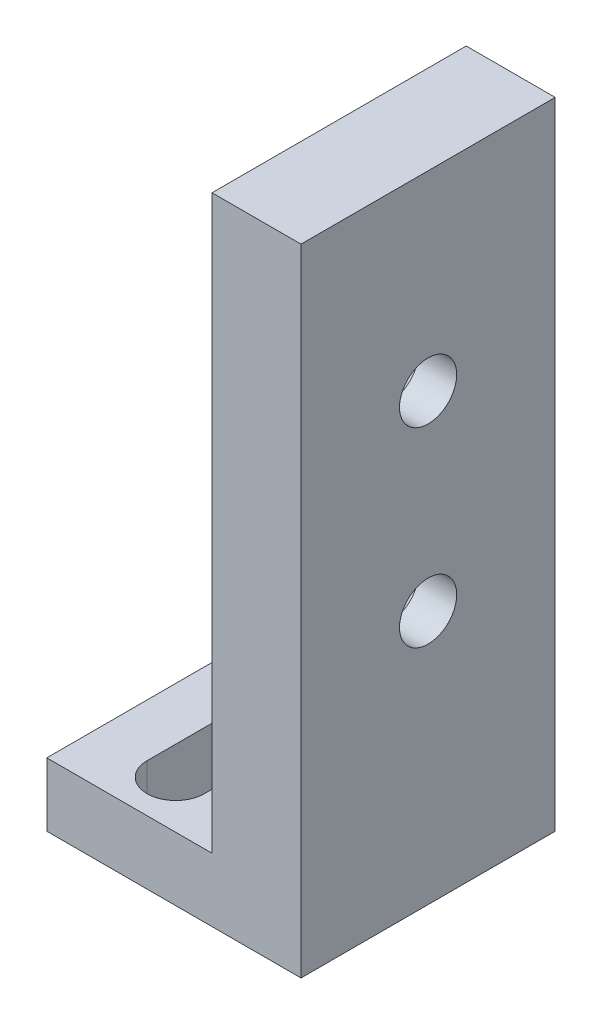
ISO-10303-21;
HEADER;
FILE_DESCRIPTION(('STEP AP214'),'2;1');
FILE_NAME('part.step','',(''),(''),'','','');
FILE_SCHEMA(('AUTOMOTIVE_DESIGN { 1 0 10303 214 1 1 1 1 }'));
ENDSEC;
DATA;
#1=APPLICATION_CONTEXT('core data for automotive mechanical design processes');
#2=APPLICATION_PROTOCOL_DEFINITION('international standard','automotive_design',2000,#1);
#3=PRODUCT_CONTEXT('',#1,'mechanical');
#4=PRODUCT('Part','Part','',(#3));
#5=PRODUCT_RELATED_PRODUCT_CATEGORY('part','',(#4));
#6=PRODUCT_DEFINITION_FORMATION('','',#4);
#7=PRODUCT_DEFINITION_CONTEXT('part definition',#1,'design');
#8=PRODUCT_DEFINITION('design','',#6,#7);
#9=PRODUCT_DEFINITION_SHAPE('','',#8);
#10=(LENGTH_UNIT() NAMED_UNIT(*) SI_UNIT(.MILLI.,.METRE.));
#11=(NAMED_UNIT(*) PLANE_ANGLE_UNIT() SI_UNIT($,.RADIAN.));
#12=(NAMED_UNIT(*) SI_UNIT($,.STERADIAN.) SOLID_ANGLE_UNIT());
#13=UNCERTAINTY_MEASURE_WITH_UNIT(LENGTH_MEASURE(1.E-05),#10,'distance_accuracy_value','');
#14=(GEOMETRIC_REPRESENTATION_CONTEXT(3) GLOBAL_UNCERTAINTY_ASSIGNED_CONTEXT((#13)) GLOBAL_UNIT_ASSIGNED_CONTEXT((#10,
#11,#12)) REPRESENTATION_CONTEXT('',''));
#15=CARTESIAN_POINT('',(0.,0.,0.));
#16=DIRECTION('',(0.,0.,1.));
#17=DIRECTION('',(1.,0.,0.));
#18=AXIS2_PLACEMENT_3D('',#15,#16,#17);
#19=CARTESIAN_POINT('',(20.,20.,10.));
#20=DIRECTION('',(-1.,0.,0.));
#21=DIRECTION('',(0.,0.,1.));
#22=AXIS2_PLACEMENT_3D('',#19,#20,#21);
#23=CYLINDRICAL_SURFACE('',#22,2.25);
#24=CARTESIAN_POINT('',(20.,20.,10.));
#25=DIRECTION('',(-1.,0.,0.));
#26=DIRECTION('',(0.,0.,1.));
#27=AXIS2_PLACEMENT_3D('',#24,#25,#26);
#28=CIRCLE('',#27,2.25);
#29=CARTESIAN_POINT('',(20.,20.,12.25));
#30=VERTEX_POINT('',#29);
#31=EDGE_CURVE('E254',#30,#30,#28,.T.);
#32=ORIENTED_EDGE('',*,*,#31,.F.);
#33=EDGE_LOOP('',(#32));
#34=FACE_BOUND('',#33,.T.);
#35=CARTESIAN_POINT('',(17.,20.,10.));
#36=DIRECTION('',(-1.,0.,0.));
#37=DIRECTION('',(0.,0.,1.));
#38=AXIS2_PLACEMENT_3D('',#35,#36,#37);
#39=CIRCLE('',#38,2.25);
#40=CARTESIAN_POINT('',(17.,20.,12.25));
#41=VERTEX_POINT('',#40);
#42=EDGE_CURVE('E222',#41,#41,#39,.T.);
#43=ORIENTED_EDGE('',*,*,#42,.T.);
#44=EDGE_LOOP('',(#43));
#45=FACE_BOUND('',#44,.T.);
#46=ADVANCED_FACE('F41',(#34,#45),#23,.F.);
#47=CARTESIAN_POINT('',(20.,35.,10.));
#48=DIRECTION('',(-1.,0.,0.));
#49=DIRECTION('',(0.,0.,1.));
#50=AXIS2_PLACEMENT_3D('',#47,#48,#49);
#51=CYLINDRICAL_SURFACE('',#50,2.25);
#52=CARTESIAN_POINT('',(20.,35.,10.));
#53=DIRECTION('',(-1.,0.,0.));
#54=DIRECTION('',(0.,0.,1.));
#55=AXIS2_PLACEMENT_3D('',#52,#53,#54);
#56=CIRCLE('',#55,2.25);
#57=CARTESIAN_POINT('',(20.,35.,12.25));
#58=VERTEX_POINT('',#57);
#59=EDGE_CURVE('E334',#58,#58,#56,.T.);
#60=ORIENTED_EDGE('',*,*,#59,.F.);
#61=EDGE_LOOP('',(#60));
#62=FACE_BOUND('',#61,.T.);
#63=CARTESIAN_POINT('',(17.,35.,10.));
#64=DIRECTION('',(-1.,0.,0.));
#65=DIRECTION('',(0.,0.,1.));
#66=AXIS2_PLACEMENT_3D('',#63,#64,#65);
#67=CIRCLE('',#66,2.25);
#68=CARTESIAN_POINT('',(17.,35.,12.25));
#69=VERTEX_POINT('',#68);
#70=EDGE_CURVE('E266',#69,#69,#67,.T.);
#71=ORIENTED_EDGE('',*,*,#70,.T.);
#72=EDGE_LOOP('',(#71));
#73=FACE_BOUND('',#72,.T.);
#74=ADVANCED_FACE('F482',(#62,#73),#51,.F.);
#75=CARTESIAN_POINT('',(20.,0.,20.));
#76=DIRECTION('',(0.,1.,0.));
#77=DIRECTION('',(-1.,0.,0.));
#78=AXIS2_PLACEMENT_3D('',#75,#76,#77);
#79=PLANE('',#78);
#80=DIRECTION('',(0.,0.,-1.));
#81=VECTOR('',#80,1.);
#82=CARTESIAN_POINT('',(8.63999999999999,0.,3.75));
#83=LINE('',#82,#81);
#84=CARTESIAN_POINT('',(8.64,0.,16.25));
#85=VERTEX_POINT('',#84);
#86=CARTESIAN_POINT('',(8.63999999999999,0.,3.75));
#87=VERTEX_POINT('',#86);
#88=EDGE_CURVE('E355',#85,#87,#83,.T.);
#89=ORIENTED_EDGE('',*,*,#88,.T.);
#90=CARTESIAN_POINT('',(6.39,0.,3.75));
#91=DIRECTION('',(0.,1.,0.));
#92=DIRECTION('',(0.,0.,1.));
#93=AXIS2_PLACEMENT_3D('',#90,#91,#92);
#94=CIRCLE('',#93,2.25);
#95=CARTESIAN_POINT('',(4.14,0.,3.75));
#96=VERTEX_POINT('',#95);
#97=EDGE_CURVE('E342',#87,#96,#94,.T.);
#98=ORIENTED_EDGE('',*,*,#97,.T.);
#99=DIRECTION('',(0.,0.,1.));
#100=VECTOR('',#99,1.);
#101=CARTESIAN_POINT('',(4.14,0.,3.75));
#102=LINE('',#101,#100);
#103=CARTESIAN_POINT('',(4.14,0.,16.25));
#104=VERTEX_POINT('',#103);
#105=EDGE_CURVE('E346',#96,#104,#102,.T.);
#106=ORIENTED_EDGE('',*,*,#105,.T.);
#107=CARTESIAN_POINT('',(6.39,0.,16.25));
#108=DIRECTION('',(0.,1.,0.));
#109=DIRECTION('',(0.,0.,1.));
#110=AXIS2_PLACEMENT_3D('',#107,#108,#109);
#111=CIRCLE('',#110,2.25);
#112=EDGE_CURVE('E351',#104,#85,#111,.T.);
#113=ORIENTED_EDGE('',*,*,#112,.T.);
#114=EDGE_LOOP('',(#89,#98,#106,#113));
#115=FACE_BOUND('',#114,.T.);
#116=DIRECTION('',(1.,0.,0.));
#117=VECTOR('',#116,1.);
#118=CARTESIAN_POINT('',(20.,0.,0.));
#119=LINE('',#118,#117);
#120=CARTESIAN_POINT('',(0.,0.,0.));
#121=VERTEX_POINT('',#120);
#122=CARTESIAN_POINT('',(20.,0.,0.));
#123=VERTEX_POINT('',#122);
#124=EDGE_CURVE('E376',#121,#123,#119,.T.);
#125=ORIENTED_EDGE('',*,*,#124,.T.);
#126=DIRECTION('',(0.,0.,-1.));
#127=VECTOR('',#126,1.);
#128=CARTESIAN_POINT('',(20.,0.,20.));
#129=LINE('',#128,#127);
#130=CARTESIAN_POINT('',(20.,0.,20.));
#131=VERTEX_POINT('',#130);
#132=EDGE_CURVE('E11',#131,#123,#129,.T.);
#133=ORIENTED_EDGE('',*,*,#132,.F.);
#134=DIRECTION('',(1.,0.,0.));
#135=VECTOR('',#134,1.);
#136=CARTESIAN_POINT('',(20.,0.,20.));
#137=LINE('',#136,#135);
#138=CARTESIAN_POINT('',(0.,0.,20.));
#139=VERTEX_POINT('',#138);
#140=EDGE_CURVE('E386',#139,#131,#137,.T.);
#141=ORIENTED_EDGE('',*,*,#140,.F.);
#142=DIRECTION('',(0.,0.,-1.));
#143=VECTOR('',#142,1.);
#144=CARTESIAN_POINT('',(0.,0.,20.));
#145=LINE('',#144,#143);
#146=EDGE_CURVE('E406',#139,#121,#145,.T.);
#147=ORIENTED_EDGE('',*,*,#146,.T.);
#148=EDGE_LOOP('',(#125,#133,#141,#147));
#149=FACE_BOUND('',#148,.T.);
#150=ADVANCED_FACE('F43',(#115,#149),#79,.F.);
#151=CARTESIAN_POINT('',(20.,50.,20.));
#152=DIRECTION('',(-1.,0.,0.));
#153=DIRECTION('',(0.,-1.,0.));
#154=AXIS2_PLACEMENT_3D('',#151,#152,#153);
#155=PLANE('',#154);
#156=ORIENTED_EDGE('',*,*,#59,.T.);
#157=EDGE_LOOP('',(#156));
#158=FACE_BOUND('',#157,.T.);
#159=ORIENTED_EDGE('',*,*,#31,.T.);
#160=EDGE_LOOP('',(#159));
#161=FACE_BOUND('',#160,.T.);
#162=DIRECTION('',(0.,1.,0.));
#163=VECTOR('',#162,1.);
#164=CARTESIAN_POINT('',(20.,50.,0.));
#165=LINE('',#164,#163);
#166=CARTESIAN_POINT('',(20.,50.,0.));
#167=VERTEX_POINT('',#166);
#168=EDGE_CURVE('E410',#123,#167,#165,.T.);
#169=ORIENTED_EDGE('',*,*,#168,.T.);
#170=DIRECTION('',(0.,0.,-1.));
#171=VECTOR('',#170,1.);
#172=CARTESIAN_POINT('',(20.,50.,20.));
#173=LINE('',#172,#171);
#174=CARTESIAN_POINT('',(20.,50.,20.));
#175=VERTEX_POINT('',#174);
#176=EDGE_CURVE('E50',#175,#167,#173,.T.);
#177=ORIENTED_EDGE('',*,*,#176,.F.);
#178=DIRECTION('',(0.,1.,0.));
#179=VECTOR('',#178,1.);
#180=CARTESIAN_POINT('',(20.,50.,20.));
#181=LINE('',#180,#179);
#182=EDGE_CURVE('E390',#131,#175,#181,.T.);
#183=ORIENTED_EDGE('',*,*,#182,.F.);
#184=ORIENTED_EDGE('',*,*,#132,.T.);
#185=EDGE_LOOP('',(#169,#177,#183,#184));
#186=FACE_BOUND('',#185,.T.);
#187=ADVANCED_FACE('F467',(#158,#161,#186),#155,.F.);
#188=CARTESIAN_POINT('',(13.,50.,20.));
#189=DIRECTION('',(0.,-1.,0.));
#190=DIRECTION('',(0.,0.,-1.));
#191=AXIS2_PLACEMENT_3D('',#188,#189,#190);
#192=PLANE('',#191);
#193=DIRECTION('',(-1.,0.,0.));
#194=VECTOR('',#193,1.);
#195=CARTESIAN_POINT('',(13.,50.,0.));
#196=LINE('',#195,#194);
#197=CARTESIAN_POINT('',(13.,50.,0.));
#198=VERTEX_POINT('',#197);
#199=EDGE_CURVE('E413',#167,#198,#196,.T.);
#200=ORIENTED_EDGE('',*,*,#199,.T.);
#201=DIRECTION('',(0.,0.,-1.));
#202=VECTOR('',#201,1.);
#203=CARTESIAN_POINT('',(13.,50.,20.));
#204=LINE('',#203,#202);
#205=CARTESIAN_POINT('',(13.,50.,20.));
#206=VERTEX_POINT('',#205);
#207=EDGE_CURVE('E435',#206,#198,#204,.T.);
#208=ORIENTED_EDGE('',*,*,#207,.F.);
#209=DIRECTION('',(-1.,0.,0.));
#210=VECTOR('',#209,1.);
#211=CARTESIAN_POINT('',(13.,50.,20.));
#212=LINE('',#211,#210);
#213=EDGE_CURVE('E394',#175,#206,#212,.T.);
#214=ORIENTED_EDGE('',*,*,#213,.F.);
#215=ORIENTED_EDGE('',*,*,#176,.T.);
#216=EDGE_LOOP('',(#200,#208,#214,#215));
#217=FACE_BOUND('',#216,.T.);
#218=ADVANCED_FACE('F444',(#217),#192,.F.);
#219=CARTESIAN_POINT('',(13.,5.,20.));
#220=DIRECTION('',(1.,0.,0.));
#221=DIRECTION('',(0.,1.,0.));
#222=AXIS2_PLACEMENT_3D('',#219,#220,#221);
#223=PLANE('',#222);
#224=DIRECTION('',(0.,-0.866025403784438,0.500000000000001));
#225=VECTOR('',#224,1.);
#226=CARTESIAN_POINT('',(13.,20.,5.95854811567261));
#227=LINE('',#226,#225);
#228=CARTESIAN_POINT('',(13.,20.,5.95854811567261));
#229=VERTEX_POINT('',#228);
#230=CARTESIAN_POINT('',(13.,16.5,7.97927405783631));
#231=VERTEX_POINT('',#230);
#232=EDGE_CURVE('E237',#229,#231,#227,.T.);
#233=ORIENTED_EDGE('',*,*,#232,.F.);
#234=DIRECTION('',(0.,-0.866025403784438,-0.500000000000001));
#235=VECTOR('',#234,1.);
#236=CARTESIAN_POINT('',(13.,23.5,7.97927405783631));
#237=LINE('',#236,#235);
#238=CARTESIAN_POINT('',(13.,23.5,7.97927405783631));
#239=VERTEX_POINT('',#238);
#240=EDGE_CURVE('E57',#239,#229,#237,.T.);
#241=ORIENTED_EDGE('',*,*,#240,.F.);
#242=DIRECTION('',(0.,0.,-1.));
#243=VECTOR('',#242,1.);
#244=CARTESIAN_POINT('',(13.,23.5,12.0207259421637));
#245=LINE('',#244,#243);
#246=CARTESIAN_POINT('',(13.,23.5,12.0207259421637));
#247=VERTEX_POINT('',#246);
#248=EDGE_CURVE('E215',#247,#239,#245,.T.);
#249=ORIENTED_EDGE('',*,*,#248,.F.);
#250=DIRECTION('',(0.,0.866025403784438,-0.500000000000001));
#251=VECTOR('',#250,1.);
#252=CARTESIAN_POINT('',(13.,20.,14.0414518843274));
#253=LINE('',#252,#251);
#254=CARTESIAN_POINT('',(13.,20.,14.0414518843274));
#255=VERTEX_POINT('',#254);
#256=EDGE_CURVE('E219',#255,#247,#253,.T.);
#257=ORIENTED_EDGE('',*,*,#256,.F.);
#258=DIRECTION('',(0.,0.866025403784438,0.500000000000001));
#259=VECTOR('',#258,1.);
#260=CARTESIAN_POINT('',(13.,16.5,12.0207259421637));
#261=LINE('',#260,#259);
#262=CARTESIAN_POINT('',(13.,16.5,12.0207259421637));
#263=VERTEX_POINT('',#262);
#264=EDGE_CURVE('E244',#263,#255,#261,.T.);
#265=ORIENTED_EDGE('',*,*,#264,.F.);
#266=DIRECTION('',(0.,0.,1.));
#267=VECTOR('',#266,1.);
#268=CARTESIAN_POINT('',(13.,16.5,7.97927405783631));
#269=LINE('',#268,#267);
#270=EDGE_CURVE('E240',#231,#263,#269,.T.);
#271=ORIENTED_EDGE('',*,*,#270,.F.);
#272=EDGE_LOOP('',(#233,#241,#249,#257,#265,#271));
#273=FACE_BOUND('',#272,.T.);
#274=DIRECTION('',(0.,-0.866025403784438,0.5));
#275=VECTOR('',#274,1.);
#276=CARTESIAN_POINT('',(13.,35.,5.95854811567262));
#277=LINE('',#276,#275);
#278=CARTESIAN_POINT('',(13.,35.,5.95854811567262));
#279=VERTEX_POINT('',#278);
#280=CARTESIAN_POINT('',(13.,31.5,7.97927405783631));
#281=VERTEX_POINT('',#280);
#282=EDGE_CURVE('E298',#279,#281,#277,.T.);
#283=ORIENTED_EDGE('',*,*,#282,.F.);
#284=DIRECTION('',(0.,-0.866025403784439,-0.5));
#285=VECTOR('',#284,1.);
#286=CARTESIAN_POINT('',(13.,38.5,7.97927405783631));
#287=LINE('',#286,#285);
#288=CARTESIAN_POINT('',(13.,38.5,7.97927405783631));
#289=VERTEX_POINT('',#288);
#290=EDGE_CURVE('E65',#289,#279,#287,.T.);
#291=ORIENTED_EDGE('',*,*,#290,.F.);
#292=DIRECTION('',(0.,0.,-1.));
#293=VECTOR('',#292,1.);
#294=CARTESIAN_POINT('',(13.,38.5,12.0207259421637));
#295=LINE('',#294,#293);
#296=CARTESIAN_POINT('',(13.,38.5,12.0207259421637));
#297=VERTEX_POINT('',#296);
#298=EDGE_CURVE('E275',#297,#289,#295,.T.);
#299=ORIENTED_EDGE('',*,*,#298,.F.);
#300=DIRECTION('',(0.,0.866025403784439,-0.5));
#301=VECTOR('',#300,1.);
#302=CARTESIAN_POINT('',(13.,35.,14.0414518843274));
#303=LINE('',#302,#301);
#304=CARTESIAN_POINT('',(13.,35.,14.0414518843274));
#305=VERTEX_POINT('',#304);
#306=EDGE_CURVE('E310',#305,#297,#303,.T.);
#307=ORIENTED_EDGE('',*,*,#306,.F.);
#308=DIRECTION('',(0.,0.866025403784439,0.5));
#309=VECTOR('',#308,1.);
#310=CARTESIAN_POINT('',(13.,31.5,12.0207259421637));
#311=LINE('',#310,#309);
#312=CARTESIAN_POINT('',(13.,31.5,12.0207259421637));
#313=VERTEX_POINT('',#312);
#314=EDGE_CURVE('E306',#313,#305,#311,.T.);
#315=ORIENTED_EDGE('',*,*,#314,.F.);
#316=DIRECTION('',(0.,0.,1.));
#317=VECTOR('',#316,1.);
#318=CARTESIAN_POINT('',(13.,31.5,7.97927405783631));
#319=LINE('',#318,#317);
#320=EDGE_CURVE('E302',#281,#313,#319,.T.);
#321=ORIENTED_EDGE('',*,*,#320,.F.);
#322=EDGE_LOOP('',(#283,#291,#299,#307,#315,#321));
#323=FACE_BOUND('',#322,.T.);
#324=DIRECTION('',(0.,-1.,0.));
#325=VECTOR('',#324,1.);
#326=CARTESIAN_POINT('',(13.,5.,0.));
#327=LINE('',#326,#325);
#328=CARTESIAN_POINT('',(13.,5.,0.));
#329=VERTEX_POINT('',#328);
#330=EDGE_CURVE('E416',#198,#329,#327,.T.);
#331=ORIENTED_EDGE('',*,*,#330,.T.);
#332=DIRECTION('',(0.,0.,-1.));
#333=VECTOR('',#332,1.);
#334=CARTESIAN_POINT('',(13.,5.,20.));
#335=LINE('',#334,#333);
#336=CARTESIAN_POINT('',(13.,5.,20.));
#337=VERTEX_POINT('',#336);
#338=EDGE_CURVE('E431',#337,#329,#335,.T.);
#339=ORIENTED_EDGE('',*,*,#338,.F.);
#340=DIRECTION('',(0.,-1.,0.));
#341=VECTOR('',#340,1.);
#342=CARTESIAN_POINT('',(13.,5.,20.));
#343=LINE('',#342,#341);
#344=EDGE_CURVE('E397',#206,#337,#343,.T.);
#345=ORIENTED_EDGE('',*,*,#344,.F.);
#346=ORIENTED_EDGE('',*,*,#207,.T.);
#347=EDGE_LOOP('',(#331,#339,#345,#346));
#348=FACE_BOUND('',#347,.T.);
#349=ADVANCED_FACE('F455',(#273,#323,#348),#223,.F.);
#350=CARTESIAN_POINT('',(0.,5.,20.));
#351=DIRECTION('',(0.,-1.,0.));
#352=DIRECTION('',(0.,0.,-1.));
#353=AXIS2_PLACEMENT_3D('',#350,#351,#352);
#354=PLANE('',#353);
#355=DIRECTION('',(0.,0.,1.));
#356=VECTOR('',#355,1.);
#357=CARTESIAN_POINT('',(4.14,5.,3.75));
#358=LINE('',#357,#356);
#359=CARTESIAN_POINT('',(4.14,5.,3.75));
#360=VERTEX_POINT('',#359);
#361=CARTESIAN_POINT('',(4.14000000000001,5.,16.25));
#362=VERTEX_POINT('',#361);
#363=EDGE_CURVE('E362',#360,#362,#358,.T.);
#364=ORIENTED_EDGE('',*,*,#363,.F.);
#365=CARTESIAN_POINT('',(6.39,5.,3.75));
#366=DIRECTION('',(0.,1.,0.));
#367=DIRECTION('',(0.,0.,1.));
#368=AXIS2_PLACEMENT_3D('',#365,#366,#367);
#369=CIRCLE('',#368,2.25);
#370=CARTESIAN_POINT('',(8.63999999999999,5.,3.75));
#371=VERTEX_POINT('',#370);
#372=EDGE_CURVE('E338',#371,#360,#369,.T.);
#373=ORIENTED_EDGE('',*,*,#372,.F.);
#374=DIRECTION('',(0.,0.,-1.));
#375=VECTOR('',#374,1.);
#376=CARTESIAN_POINT('',(8.63999999999999,5.,3.75));
#377=LINE('',#376,#375);
#378=CARTESIAN_POINT('',(8.64,5.,16.25));
#379=VERTEX_POINT('',#378);
#380=EDGE_CURVE('E347',#379,#371,#377,.T.);
#381=ORIENTED_EDGE('',*,*,#380,.F.);
#382=CARTESIAN_POINT('',(6.39,5.,16.25));
#383=DIRECTION('',(0.,1.,0.));
#384=DIRECTION('',(0.,0.,1.));
#385=AXIS2_PLACEMENT_3D('',#382,#383,#384);
#386=CIRCLE('',#385,2.25);
#387=EDGE_CURVE('E366',#362,#379,#386,.T.);
#388=ORIENTED_EDGE('',*,*,#387,.F.);
#389=EDGE_LOOP('',(#364,#373,#381,#388));
#390=FACE_BOUND('',#389,.T.);
#391=DIRECTION('',(-1.,0.,0.));
#392=VECTOR('',#391,1.);
#393=CARTESIAN_POINT('',(0.,5.,0.));
#394=LINE('',#393,#392);
#395=CARTESIAN_POINT('',(0.,5.,0.));
#396=VERTEX_POINT('',#395);
#397=EDGE_CURVE('E419',#329,#396,#394,.T.);
#398=ORIENTED_EDGE('',*,*,#397,.T.);
#399=DIRECTION('',(0.,0.,-1.));
#400=VECTOR('',#399,1.);
#401=CARTESIAN_POINT('',(0.,5.,20.));
#402=LINE('',#401,#400);
#403=CARTESIAN_POINT('',(0.,5.,20.));
#404=VERTEX_POINT('',#403);
#405=EDGE_CURVE('E427',#404,#396,#402,.T.);
#406=ORIENTED_EDGE('',*,*,#405,.F.);
#407=DIRECTION('',(-1.,0.,0.));
#408=VECTOR('',#407,1.);
#409=CARTESIAN_POINT('',(0.,5.,20.));
#410=LINE('',#409,#408);
#411=EDGE_CURVE('E400',#337,#404,#410,.T.);
#412=ORIENTED_EDGE('',*,*,#411,.F.);
#413=ORIENTED_EDGE('',*,*,#338,.T.);
#414=EDGE_LOOP('',(#398,#406,#412,#413));
#415=FACE_BOUND('',#414,.T.);
#416=ADVANCED_FACE('F459',(#390,#415),#354,.F.);
#417=CARTESIAN_POINT('',(0.,0.,20.));
#418=DIRECTION('',(1.,0.,0.));
#419=DIRECTION('',(0.,0.,-1.));
#420=AXIS2_PLACEMENT_3D('',#417,#418,#419);
#421=PLANE('',#420);
#422=DIRECTION('',(0.,-1.,0.));
#423=VECTOR('',#422,1.);
#424=CARTESIAN_POINT('',(0.,0.,0.));
#425=LINE('',#424,#423);
#426=EDGE_CURVE('E391',#396,#121,#425,.T.);
#427=ORIENTED_EDGE('',*,*,#426,.T.);
#428=ORIENTED_EDGE('',*,*,#146,.F.);
#429=DIRECTION('',(0.,-1.,0.));
#430=VECTOR('',#429,1.);
#431=CARTESIAN_POINT('',(0.,0.,20.));
#432=LINE('',#431,#430);
#433=EDGE_CURVE('E403',#404,#139,#432,.T.);
#434=ORIENTED_EDGE('',*,*,#433,.F.);
#435=ORIENTED_EDGE('',*,*,#405,.T.);
#436=EDGE_LOOP('',(#427,#428,#434,#435));
#437=FACE_BOUND('',#436,.T.);
#438=ADVANCED_FACE('F470',(#437),#421,.F.);
#439=CARTESIAN_POINT('',(0.,0.,20.));
#440=DIRECTION('',(0.,0.,-1.));
#441=DIRECTION('',(-1.,0.,0.));
#442=AXIS2_PLACEMENT_3D('',#439,#440,#441);
#443=PLANE('',#442);
#444=ORIENTED_EDGE('',*,*,#140,.T.);
#445=ORIENTED_EDGE('',*,*,#182,.T.);
#446=ORIENTED_EDGE('',*,*,#213,.T.);
#447=ORIENTED_EDGE('',*,*,#344,.T.);
#448=ORIENTED_EDGE('',*,*,#411,.T.);
#449=ORIENTED_EDGE('',*,*,#433,.T.);
#450=EDGE_LOOP('',(#444,#445,#446,#447,#448,#449));
#451=FACE_BOUND('',#450,.T.);
#452=ADVANCED_FACE('F463',(#451),#443,.F.);
#453=CARTESIAN_POINT('',(0.,0.,0.));
#454=DIRECTION('',(0.,0.,-1.));
#455=DIRECTION('',(-1.,0.,0.));
#456=AXIS2_PLACEMENT_3D('',#453,#454,#455);
#457=PLANE('',#456);
#458=ORIENTED_EDGE('',*,*,#124,.F.);
#459=ORIENTED_EDGE('',*,*,#426,.F.);
#460=ORIENTED_EDGE('',*,*,#397,.F.);
#461=ORIENTED_EDGE('',*,*,#330,.F.);
#462=ORIENTED_EDGE('',*,*,#199,.F.);
#463=ORIENTED_EDGE('',*,*,#168,.F.);
#464=EDGE_LOOP('',(#458,#459,#460,#461,#462,#463));
#465=FACE_BOUND('',#464,.T.);
#466=ADVANCED_FACE('F450',(#465),#457,.T.);
#467=CARTESIAN_POINT('',(6.39,0.,3.75));
#468=DIRECTION('',(0.,1.,0.));
#469=DIRECTION('',(0.,0.,1.));
#470=AXIS2_PLACEMENT_3D('',#467,#468,#469);
#471=CYLINDRICAL_SURFACE('',#470,2.25);
#472=ORIENTED_EDGE('',*,*,#372,.T.);
#473=DIRECTION('',(0.,1.,0.));
#474=VECTOR('',#473,1.);
#475=CARTESIAN_POINT('',(4.14,0.,3.75));
#476=LINE('',#475,#474);
#477=EDGE_CURVE('E359',#96,#360,#476,.T.);
#478=ORIENTED_EDGE('',*,*,#477,.F.);
#479=ORIENTED_EDGE('',*,*,#97,.F.);
#480=DIRECTION('',(0.,1.,0.));
#481=VECTOR('',#480,1.);
#482=CARTESIAN_POINT('',(8.63999999999999,0.,3.75));
#483=LINE('',#482,#481);
#484=EDGE_CURVE('E373',#87,#371,#483,.T.);
#485=ORIENTED_EDGE('',*,*,#484,.T.);
#486=EDGE_LOOP('',(#472,#478,#479,#485));
#487=FACE_BOUND('',#486,.T.);
#488=ADVANCED_FACE('F498',(#487),#471,.F.);
#489=CARTESIAN_POINT('',(8.63999999999999,0.,3.75));
#490=DIRECTION('',(1.,0.,0.));
#491=DIRECTION('',(0.,0.,-1.));
#492=AXIS2_PLACEMENT_3D('',#489,#490,#491);
#493=PLANE('',#492);
#494=ORIENTED_EDGE('',*,*,#380,.T.);
#495=ORIENTED_EDGE('',*,*,#484,.F.);
#496=ORIENTED_EDGE('',*,*,#88,.F.);
#497=DIRECTION('',(0.,1.,0.));
#498=VECTOR('',#497,1.);
#499=CARTESIAN_POINT('',(8.64,0.,16.25));
#500=LINE('',#499,#498);
#501=EDGE_CURVE('E377',#85,#379,#500,.T.);
#502=ORIENTED_EDGE('',*,*,#501,.T.);
#503=EDGE_LOOP('',(#494,#495,#496,#502));
#504=FACE_BOUND('',#503,.T.);
#505=ADVANCED_FACE('F494',(#504),#493,.F.);
#506=CARTESIAN_POINT('',(6.39,0.,16.25));
#507=DIRECTION('',(0.,1.,0.));
#508=DIRECTION('',(0.,0.,1.));
#509=AXIS2_PLACEMENT_3D('',#506,#507,#508);
#510=CYLINDRICAL_SURFACE('',#509,2.25);
#511=ORIENTED_EDGE('',*,*,#387,.T.);
#512=ORIENTED_EDGE('',*,*,#501,.F.);
#513=ORIENTED_EDGE('',*,*,#112,.F.);
#514=DIRECTION('',(0.,1.,0.));
#515=VECTOR('',#514,1.);
#516=CARTESIAN_POINT('',(4.14000000000001,0.,16.25));
#517=LINE('',#516,#515);
#518=EDGE_CURVE('E380',#104,#362,#517,.T.);
#519=ORIENTED_EDGE('',*,*,#518,.T.);
#520=EDGE_LOOP('',(#511,#512,#513,#519));
#521=FACE_BOUND('',#520,.T.);
#522=ADVANCED_FACE('F497',(#521),#510,.F.);
#523=CARTESIAN_POINT('',(4.14,0.,3.75));
#524=DIRECTION('',(-1.,0.,0.));
#525=DIRECTION('',(0.,0.,1.));
#526=AXIS2_PLACEMENT_3D('',#523,#524,#525);
#527=PLANE('',#526);
#528=ORIENTED_EDGE('',*,*,#363,.T.);
#529=ORIENTED_EDGE('',*,*,#518,.F.);
#530=ORIENTED_EDGE('',*,*,#105,.F.);
#531=ORIENTED_EDGE('',*,*,#477,.T.);
#532=EDGE_LOOP('',(#528,#529,#530,#531));
#533=FACE_BOUND('',#532,.T.);
#534=ADVANCED_FACE('F502',(#533),#527,.F.);
#535=CARTESIAN_POINT('',(17.,38.5,7.97927405783631));
#536=DIRECTION('',(0.,0.5,-0.866025403784439));
#537=DIRECTION('',(0.,0.866025403784439,0.5));
#538=AXIS2_PLACEMENT_3D('',#535,#536,#537);
#539=PLANE('',#538);
#540=ORIENTED_EDGE('',*,*,#290,.T.);
#541=DIRECTION('',(-1.,0.,0.));
#542=VECTOR('',#541,1.);
#543=CARTESIAN_POINT('',(17.,35.,5.95854811567262));
#544=LINE('',#543,#542);
#545=CARTESIAN_POINT('',(17.,35.,5.95854811567262));
#546=VERTEX_POINT('',#545);
#547=EDGE_CURVE('E295',#546,#279,#544,.T.);
#548=ORIENTED_EDGE('',*,*,#547,.F.);
#549=DIRECTION('',(0.,-0.866025403784439,-0.5));
#550=VECTOR('',#549,1.);
#551=CARTESIAN_POINT('',(17.,38.5,7.97927405783631));
#552=LINE('',#551,#550);
#553=CARTESIAN_POINT('',(17.,38.5,7.97927405783631));
#554=VERTEX_POINT('',#553);
#555=EDGE_CURVE('E270',#554,#546,#552,.T.);
#556=ORIENTED_EDGE('',*,*,#555,.F.);
#557=DIRECTION('',(-1.,0.,0.));
#558=VECTOR('',#557,1.);
#559=CARTESIAN_POINT('',(17.,38.5,7.97927405783631));
#560=LINE('',#559,#558);
#561=EDGE_CURVE('E317',#554,#289,#560,.T.);
#562=ORIENTED_EDGE('',*,*,#561,.T.);
#563=EDGE_LOOP('',(#540,#548,#556,#562));
#564=FACE_BOUND('',#563,.T.);
#565=ADVANCED_FACE('F506',(#564),#539,.F.);
#566=CARTESIAN_POINT('',(17.,38.5,12.0207259421637));
#567=DIRECTION('',(0.,1.,0.));
#568=DIRECTION('',(0.,0.,1.));
#569=AXIS2_PLACEMENT_3D('',#566,#567,#568);
#570=PLANE('',#569);
#571=ORIENTED_EDGE('',*,*,#298,.T.);
#572=ORIENTED_EDGE('',*,*,#561,.F.);
#573=DIRECTION('',(0.,0.,-1.));
#574=VECTOR('',#573,1.);
#575=CARTESIAN_POINT('',(17.,38.5,12.0207259421637));
#576=LINE('',#575,#574);
#577=CARTESIAN_POINT('',(17.,38.5,12.0207259421637));
#578=VERTEX_POINT('',#577);
#579=EDGE_CURVE('E291',#578,#554,#576,.T.);
#580=ORIENTED_EDGE('',*,*,#579,.F.);
#581=DIRECTION('',(-1.,0.,0.));
#582=VECTOR('',#581,1.);
#583=CARTESIAN_POINT('',(17.,38.5,12.0207259421637));
#584=LINE('',#583,#582);
#585=EDGE_CURVE('E320',#578,#297,#584,.T.);
#586=ORIENTED_EDGE('',*,*,#585,.T.);
#587=EDGE_LOOP('',(#571,#572,#580,#586));
#588=FACE_BOUND('',#587,.T.);
#589=ADVANCED_FACE('F540',(#588),#570,.F.);
#590=CARTESIAN_POINT('',(17.,35.,14.0414518843274));
#591=DIRECTION('',(0.,0.5,0.866025403784439));
#592=DIRECTION('',(0.,-0.866025403784439,0.5));
#593=AXIS2_PLACEMENT_3D('',#590,#591,#592);
#594=PLANE('',#593);
#595=ORIENTED_EDGE('',*,*,#306,.T.);
#596=ORIENTED_EDGE('',*,*,#585,.F.);
#597=DIRECTION('',(0.,0.866025403784439,-0.5));
#598=VECTOR('',#597,1.);
#599=CARTESIAN_POINT('',(17.,35.,14.0414518843274));
#600=LINE('',#599,#598);
#601=CARTESIAN_POINT('',(17.,35.,14.0414518843274));
#602=VERTEX_POINT('',#601);
#603=EDGE_CURVE('E287',#602,#578,#600,.T.);
#604=ORIENTED_EDGE('',*,*,#603,.F.);
#605=DIRECTION('',(-1.,0.,0.));
#606=VECTOR('',#605,1.);
#607=CARTESIAN_POINT('',(17.,35.,14.0414518843274));
#608=LINE('',#607,#606);
#609=EDGE_CURVE('E323',#602,#305,#608,.T.);
#610=ORIENTED_EDGE('',*,*,#609,.T.);
#611=EDGE_LOOP('',(#595,#596,#604,#610));
#612=FACE_BOUND('',#611,.T.);
#613=ADVANCED_FACE('F547',(#612),#594,.F.);
#614=CARTESIAN_POINT('',(17.,31.5,12.0207259421637));
#615=DIRECTION('',(0.,-0.5,0.866025403784439));
#616=DIRECTION('',(0.,-0.866025403784439,-0.5));
#617=AXIS2_PLACEMENT_3D('',#614,#615,#616);
#618=PLANE('',#617);
#619=ORIENTED_EDGE('',*,*,#314,.T.);
#620=ORIENTED_EDGE('',*,*,#609,.F.);
#621=DIRECTION('',(0.,0.866025403784439,0.5));
#622=VECTOR('',#621,1.);
#623=CARTESIAN_POINT('',(17.,31.5,12.0207259421637));
#624=LINE('',#623,#622);
#625=CARTESIAN_POINT('',(17.,31.5,12.0207259421637));
#626=VERTEX_POINT('',#625);
#627=EDGE_CURVE('E283',#626,#602,#624,.T.);
#628=ORIENTED_EDGE('',*,*,#627,.F.);
#629=DIRECTION('',(-1.,0.,0.));
#630=VECTOR('',#629,1.);
#631=CARTESIAN_POINT('',(17.,31.5,12.0207259421637));
#632=LINE('',#631,#630);
#633=EDGE_CURVE('E326',#626,#313,#632,.T.);
#634=ORIENTED_EDGE('',*,*,#633,.T.);
#635=EDGE_LOOP('',(#619,#620,#628,#634));
#636=FACE_BOUND('',#635,.T.);
#637=ADVANCED_FACE('F555',(#636),#618,.F.);
#638=CARTESIAN_POINT('',(17.,31.5,7.97927405783631));
#639=DIRECTION('',(0.,-1.,0.));
#640=DIRECTION('',(0.,0.,-1.));
#641=AXIS2_PLACEMENT_3D('',#638,#639,#640);
#642=PLANE('',#641);
#643=ORIENTED_EDGE('',*,*,#320,.T.);
#644=ORIENTED_EDGE('',*,*,#633,.F.);
#645=DIRECTION('',(0.,0.,1.));
#646=VECTOR('',#645,1.);
#647=CARTESIAN_POINT('',(17.,31.5,7.97927405783631));
#648=LINE('',#647,#646);
#649=CARTESIAN_POINT('',(17.,31.5,7.97927405783631));
#650=VERTEX_POINT('',#649);
#651=EDGE_CURVE('E279',#650,#626,#648,.T.);
#652=ORIENTED_EDGE('',*,*,#651,.F.);
#653=DIRECTION('',(-1.,0.,0.));
#654=VECTOR('',#653,1.);
#655=CARTESIAN_POINT('',(17.,31.5,7.97927405783631));
#656=LINE('',#655,#654);
#657=EDGE_CURVE('E329',#650,#281,#656,.T.);
#658=ORIENTED_EDGE('',*,*,#657,.T.);
#659=EDGE_LOOP('',(#643,#644,#652,#658));
#660=FACE_BOUND('',#659,.T.);
#661=ADVANCED_FACE('F563',(#660),#642,.F.);
#662=CARTESIAN_POINT('',(17.,35.,5.95854811567262));
#663=DIRECTION('',(0.,-0.5,-0.866025403784438));
#664=DIRECTION('',(0.,0.866025403784438,-0.5));
#665=AXIS2_PLACEMENT_3D('',#662,#663,#664);
#666=PLANE('',#665);
#667=ORIENTED_EDGE('',*,*,#282,.T.);
#668=ORIENTED_EDGE('',*,*,#657,.F.);
#669=DIRECTION('',(0.,-0.866025403784438,0.5));
#670=VECTOR('',#669,1.);
#671=CARTESIAN_POINT('',(17.,35.,5.95854811567262));
#672=LINE('',#671,#670);
#673=EDGE_CURVE('E274',#546,#650,#672,.T.);
#674=ORIENTED_EDGE('',*,*,#673,.F.);
#675=ORIENTED_EDGE('',*,*,#547,.T.);
#676=EDGE_LOOP('',(#667,#668,#674,#675));
#677=FACE_BOUND('',#676,.T.);
#678=ADVANCED_FACE('F571',(#677),#666,.F.);
#679=CARTESIAN_POINT('',(17.,0.,0.));
#680=DIRECTION('',(-1.,0.,0.));
#681=DIRECTION('',(0.,0.,1.));
#682=AXIS2_PLACEMENT_3D('',#679,#680,#681);
#683=PLANE('',#682);
#684=ORIENTED_EDGE('',*,*,#70,.F.);
#685=EDGE_LOOP('',(#684));
#686=FACE_BOUND('',#685,.T.);
#687=ORIENTED_EDGE('',*,*,#555,.T.);
#688=ORIENTED_EDGE('',*,*,#673,.T.);
#689=ORIENTED_EDGE('',*,*,#651,.T.);
#690=ORIENTED_EDGE('',*,*,#627,.T.);
#691=ORIENTED_EDGE('',*,*,#603,.T.);
#692=ORIENTED_EDGE('',*,*,#579,.T.);
#693=EDGE_LOOP('',(#687,#688,#689,#690,#691,#692));
#694=FACE_BOUND('',#693,.T.);
#695=ADVANCED_FACE('F579',(#686,#694),#683,.T.);
#696=CARTESIAN_POINT('',(17.,23.5,7.97927405783631));
#697=DIRECTION('',(0.,0.500000000000001,-0.866025403784438));
#698=DIRECTION('',(0.,0.866025403784438,0.500000000000001));
#699=AXIS2_PLACEMENT_3D('',#696,#697,#698);
#700=PLANE('',#699);
#701=ORIENTED_EDGE('',*,*,#240,.T.);
#702=DIRECTION('',(-1.,0.,0.));
#703=VECTOR('',#702,1.);
#704=CARTESIAN_POINT('',(17.,20.,5.95854811567261));
#705=LINE('',#704,#703);
#706=CARTESIAN_POINT('',(17.,20.,5.95854811567261));
#707=VERTEX_POINT('',#706);
#708=EDGE_CURVE('E189',#707,#229,#705,.T.);
#709=ORIENTED_EDGE('',*,*,#708,.F.);
#710=DIRECTION('',(0.,-0.866025403784438,-0.500000000000001));
#711=VECTOR('',#710,1.);
#712=CARTESIAN_POINT('',(17.,23.5,7.97927405783631));
#713=LINE('',#712,#711);
#714=CARTESIAN_POINT('',(17.,23.5,7.97927405783631));
#715=VERTEX_POINT('',#714);
#716=EDGE_CURVE('E193',#715,#707,#713,.T.);
#717=ORIENTED_EDGE('',*,*,#716,.F.);
#718=DIRECTION('',(-1.,0.,0.));
#719=VECTOR('',#718,1.);
#720=CARTESIAN_POINT('',(17.,23.5,7.97927405783631));
#721=LINE('',#720,#719);
#722=EDGE_CURVE('E251',#715,#239,#721,.T.);
#723=ORIENTED_EDGE('',*,*,#722,.T.);
#724=EDGE_LOOP('',(#701,#709,#717,#723));
#725=FACE_BOUND('',#724,.T.);
#726=ADVANCED_FACE('F191',(#725),#700,.F.);
#727=CARTESIAN_POINT('',(17.,23.5,12.0207259421637));
#728=DIRECTION('',(0.,1.,0.));
#729=DIRECTION('',(0.,0.,1.));
#730=AXIS2_PLACEMENT_3D('',#727,#728,#729);
#731=PLANE('',#730);
#732=ORIENTED_EDGE('',*,*,#248,.T.);
#733=ORIENTED_EDGE('',*,*,#722,.F.);
#734=DIRECTION('',(0.,0.,-1.));
#735=VECTOR('',#734,1.);
#736=CARTESIAN_POINT('',(17.,23.5,12.0207259421637));
#737=LINE('',#736,#735);
#738=CARTESIAN_POINT('',(17.,23.5,12.0207259421637));
#739=VERTEX_POINT('',#738);
#740=EDGE_CURVE('E200',#739,#715,#737,.T.);
#741=ORIENTED_EDGE('',*,*,#740,.F.);
#742=DIRECTION('',(-1.,0.,0.));
#743=VECTOR('',#742,1.);
#744=CARTESIAN_POINT('',(17.,23.5,12.0207259421637));
#745=LINE('',#744,#743);
#746=EDGE_CURVE('E255',#739,#247,#745,.T.);
#747=ORIENTED_EDGE('',*,*,#746,.T.);
#748=EDGE_LOOP('',(#732,#733,#741,#747));
#749=FACE_BOUND('',#748,.T.);
#750=ADVANCED_FACE('F594',(#749),#731,.F.);
#751=CARTESIAN_POINT('',(17.,20.,14.0414518843274));
#752=DIRECTION('',(0.,0.500000000000001,0.866025403784438));
#753=DIRECTION('',(0.,-0.866025403784438,0.500000000000001));
#754=AXIS2_PLACEMENT_3D('',#751,#752,#753);
#755=PLANE('',#754);
#756=ORIENTED_EDGE('',*,*,#256,.T.);
#757=ORIENTED_EDGE('',*,*,#746,.F.);
#758=DIRECTION('',(0.,0.866025403784438,-0.500000000000001));
#759=VECTOR('',#758,1.);
#760=CARTESIAN_POINT('',(17.,20.,14.0414518843274));
#761=LINE('',#760,#759);
#762=CARTESIAN_POINT('',(17.,20.,14.0414518843274));
#763=VERTEX_POINT('',#762);
#764=EDGE_CURVE('E230',#763,#739,#761,.T.);
#765=ORIENTED_EDGE('',*,*,#764,.F.);
#766=DIRECTION('',(-1.,0.,0.));
#767=VECTOR('',#766,1.);
#768=CARTESIAN_POINT('',(17.,20.,14.0414518843274));
#769=LINE('',#768,#767);
#770=EDGE_CURVE('E258',#763,#255,#769,.T.);
#771=ORIENTED_EDGE('',*,*,#770,.T.);
#772=EDGE_LOOP('',(#756,#757,#765,#771));
#773=FACE_BOUND('',#772,.T.);
#774=ADVANCED_FACE('F601',(#773),#755,.F.);
#775=CARTESIAN_POINT('',(17.,16.5,12.0207259421637));
#776=DIRECTION('',(0.,-0.500000000000001,0.866025403784438));
#777=DIRECTION('',(0.,-0.866025403784438,-0.500000000000001));
#778=AXIS2_PLACEMENT_3D('',#775,#776,#777);
#779=PLANE('',#778);
#780=ORIENTED_EDGE('',*,*,#264,.T.);
#781=ORIENTED_EDGE('',*,*,#770,.F.);
#782=DIRECTION('',(0.,0.866025403784438,0.500000000000001));
#783=VECTOR('',#782,1.);
#784=CARTESIAN_POINT('',(17.,16.5,12.0207259421637));
#785=LINE('',#784,#783);
#786=CARTESIAN_POINT('',(17.,16.5,12.0207259421637));
#787=VERTEX_POINT('',#786);
#788=EDGE_CURVE('E226',#787,#763,#785,.T.);
#789=ORIENTED_EDGE('',*,*,#788,.F.);
#790=DIRECTION('',(-1.,0.,0.));
#791=VECTOR('',#790,1.);
#792=CARTESIAN_POINT('',(17.,16.5,12.0207259421637));
#793=LINE('',#792,#791);
#794=EDGE_CURVE('E261',#787,#263,#793,.T.);
#795=ORIENTED_EDGE('',*,*,#794,.T.);
#796=EDGE_LOOP('',(#780,#781,#789,#795));
#797=FACE_BOUND('',#796,.T.);
#798=ADVANCED_FACE('F609',(#797),#779,.F.);
#799=CARTESIAN_POINT('',(17.,16.5,7.97927405783631));
#800=DIRECTION('',(0.,-1.,0.));
#801=DIRECTION('',(0.,0.,-1.));
#802=AXIS2_PLACEMENT_3D('',#799,#800,#801);
#803=PLANE('',#802);
#804=ORIENTED_EDGE('',*,*,#270,.T.);
#805=ORIENTED_EDGE('',*,*,#794,.F.);
#806=DIRECTION('',(0.,0.,1.));
#807=VECTOR('',#806,1.);
#808=CARTESIAN_POINT('',(17.,16.5,7.97927405783631));
#809=LINE('',#808,#807);
#810=CARTESIAN_POINT('',(17.,16.5,7.97927405783631));
#811=VERTEX_POINT('',#810);
#812=EDGE_CURVE('E209',#811,#787,#809,.T.);
#813=ORIENTED_EDGE('',*,*,#812,.F.);
#814=DIRECTION('',(-1.,0.,0.));
#815=VECTOR('',#814,1.);
#816=CARTESIAN_POINT('',(17.,16.5,7.97927405783631));
#817=LINE('',#816,#815);
#818=EDGE_CURVE('E199',#811,#231,#817,.T.);
#819=ORIENTED_EDGE('',*,*,#818,.T.);
#820=EDGE_LOOP('',(#804,#805,#813,#819));
#821=FACE_BOUND('',#820,.T.);
#822=ADVANCED_FACE('F617',(#821),#803,.F.);
#823=CARTESIAN_POINT('',(17.,20.,5.95854811567261));
#824=DIRECTION('',(0.,-0.500000000000001,-0.866025403784438));
#825=DIRECTION('',(0.,0.866025403784438,-0.500000000000001));
#826=AXIS2_PLACEMENT_3D('',#823,#824,#825);
#827=PLANE('',#826);
#828=ORIENTED_EDGE('',*,*,#232,.T.);
#829=ORIENTED_EDGE('',*,*,#818,.F.);
#830=DIRECTION('',(0.,-0.866025403784438,0.500000000000001));
#831=VECTOR('',#830,1.);
#832=CARTESIAN_POINT('',(17.,20.,5.95854811567261));
#833=LINE('',#832,#831);
#834=EDGE_CURVE('E203',#707,#811,#833,.T.);
#835=ORIENTED_EDGE('',*,*,#834,.F.);
#836=ORIENTED_EDGE('',*,*,#708,.T.);
#837=EDGE_LOOP('',(#828,#829,#835,#836));
#838=FACE_BOUND('',#837,.T.);
#839=ADVANCED_FACE('F204',(#838),#827,.F.);
#840=CARTESIAN_POINT('',(17.,0.,0.));
#841=DIRECTION('',(-1.,0.,0.));
#842=DIRECTION('',(0.,0.,1.));
#843=AXIS2_PLACEMENT_3D('',#840,#841,#842);
#844=PLANE('',#843);
#845=ORIENTED_EDGE('',*,*,#42,.F.);
#846=EDGE_LOOP('',(#845));
#847=FACE_BOUND('',#846,.T.);
#848=ORIENTED_EDGE('',*,*,#716,.T.);
#849=ORIENTED_EDGE('',*,*,#834,.T.);
#850=ORIENTED_EDGE('',*,*,#812,.T.);
#851=ORIENTED_EDGE('',*,*,#788,.T.);
#852=ORIENTED_EDGE('',*,*,#764,.T.);
#853=ORIENTED_EDGE('',*,*,#740,.T.);
#854=EDGE_LOOP('',(#848,#849,#850,#851,#852,#853));
#855=FACE_BOUND('',#854,.T.);
#856=ADVANCED_FACE('F211',(#847,#855),#844,.T.);
#857=CLOSED_SHELL('',(#46,#74,#150,#187,#218,#349,#416,#438,#452,#466,#488,#505,#522,#534,#565,
#589,#613,#637,#661,#678,#695,#726,#750,#774,#798,#822,#839,#856));
#858=MANIFOLD_SOLID_BREP('B2',#857);
#859=ADVANCED_BREP_SHAPE_REPRESENTATION('',(#18,#858),#14);
#860=SHAPE_DEFINITION_REPRESENTATION(#9,#859);
ENDSEC;
END-ISO-10303-21;
